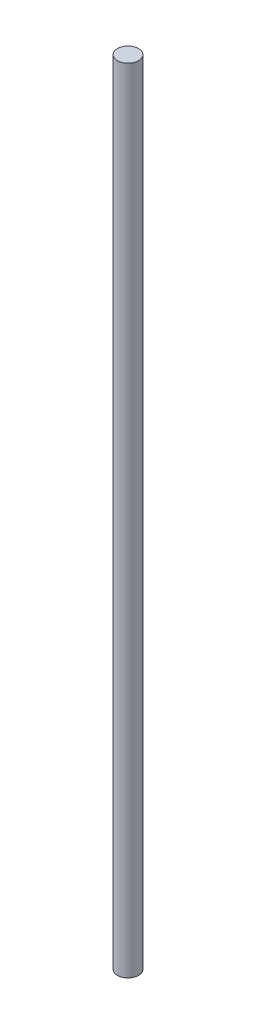
ISO-10303-21;
HEADER;
FILE_DESCRIPTION(('STEP AP214'),'2;1');
FILE_NAME('part.step','',(''),(''),'','','');
FILE_SCHEMA(('AUTOMOTIVE_DESIGN { 1 0 10303 214 1 1 1 1 }'));
ENDSEC;
DATA;
#1=APPLICATION_CONTEXT('core data for automotive mechanical design processes');
#2=APPLICATION_PROTOCOL_DEFINITION('international standard','automotive_design',2000,#1);
#3=PRODUCT_CONTEXT('',#1,'mechanical');
#4=PRODUCT('Part','Part','',(#3));
#5=PRODUCT_RELATED_PRODUCT_CATEGORY('part','',(#4));
#6=PRODUCT_DEFINITION_FORMATION('','',#4);
#7=PRODUCT_DEFINITION_CONTEXT('part definition',#1,'design');
#8=PRODUCT_DEFINITION('design','',#6,#7);
#9=PRODUCT_DEFINITION_SHAPE('','',#8);
#10=(LENGTH_UNIT() NAMED_UNIT(*) SI_UNIT(.MILLI.,.METRE.));
#11=(NAMED_UNIT(*) PLANE_ANGLE_UNIT() SI_UNIT($,.RADIAN.));
#12=(NAMED_UNIT(*) SI_UNIT($,.STERADIAN.) SOLID_ANGLE_UNIT());
#13=UNCERTAINTY_MEASURE_WITH_UNIT(LENGTH_MEASURE(1.E-05),#10,'distance_accuracy_value','');
#14=(GEOMETRIC_REPRESENTATION_CONTEXT(3) GLOBAL_UNCERTAINTY_ASSIGNED_CONTEXT((#13)) GLOBAL_UNIT_ASSIGNED_CONTEXT((#10,
#11,#12)) REPRESENTATION_CONTEXT('',''));
#15=CARTESIAN_POINT('',(0.,0.,0.));
#16=DIRECTION('',(0.,0.,1.));
#17=DIRECTION('',(1.,0.,0.));
#18=AXIS2_PLACEMENT_3D('',#15,#16,#17);
#19=CARTESIAN_POINT('',(0.,450.,0.));
#20=DIRECTION('',(0.,-1.,0.));
#21=DIRECTION('',(0.,0.,-1.));
#22=AXIS2_PLACEMENT_3D('',#19,#20,#21);
#23=CYLINDRICAL_SURFACE('',#22,6.);
#24=CARTESIAN_POINT('',(0.,450.,0.));
#25=DIRECTION('',(0.,1.,0.));
#26=DIRECTION('',(0.,0.,1.));
#27=AXIS2_PLACEMENT_3D('',#24,#25,#26);
#28=CIRCLE('',#27,6.);
#29=CARTESIAN_POINT('',(0.,450.,6.));
#30=VERTEX_POINT('',#29);
#31=EDGE_CURVE('E10',#30,#30,#28,.T.);
#32=ORIENTED_EDGE('',*,*,#31,.F.);
#33=EDGE_LOOP('',(#32));
#34=FACE_BOUND('',#33,.T.);
#35=CARTESIAN_POINT('',(0.,0.,0.));
#36=DIRECTION('',(0.,1.,0.));
#37=DIRECTION('',(0.,0.,1.));
#38=AXIS2_PLACEMENT_3D('',#35,#36,#37);
#39=CIRCLE('',#38,6.);
#40=CARTESIAN_POINT('',(0.,0.,6.));
#41=VERTEX_POINT('',#40);
#42=EDGE_CURVE('E34',#41,#41,#39,.T.);
#43=ORIENTED_EDGE('',*,*,#42,.T.);
#44=EDGE_LOOP('',(#43));
#45=FACE_BOUND('',#44,.T.);
#46=ADVANCED_FACE('F31',(#34,#45),#23,.T.);
#47=CARTESIAN_POINT('',(0.,450.,0.));
#48=DIRECTION('',(0.,1.,0.));
#49=DIRECTION('',(0.,0.,1.));
#50=AXIS2_PLACEMENT_3D('',#47,#48,#49);
#51=PLANE('',#50);
#52=ORIENTED_EDGE('',*,*,#31,.T.);
#53=EDGE_LOOP('',(#52));
#54=FACE_BOUND('',#53,.T.);
#55=ADVANCED_FACE('F46',(#54),#51,.T.);
#56=CARTESIAN_POINT('',(0.,0.,0.));
#57=DIRECTION('',(0.,1.,0.));
#58=DIRECTION('',(0.,0.,1.));
#59=AXIS2_PLACEMENT_3D('',#56,#57,#58);
#60=PLANE('',#59);
#61=ORIENTED_EDGE('',*,*,#42,.F.);
#62=EDGE_LOOP('',(#61));
#63=FACE_BOUND('',#62,.T.);
#64=ADVANCED_FACE('F44',(#63),#60,.F.);
#65=CLOSED_SHELL('',(#46,#55,#64));
#66=MANIFOLD_SOLID_BREP('B2',#65);
#67=ADVANCED_BREP_SHAPE_REPRESENTATION('',(#18,#66),#14);
#68=SHAPE_DEFINITION_REPRESENTATION(#9,#67);
ENDSEC;
END-ISO-10303-21;
